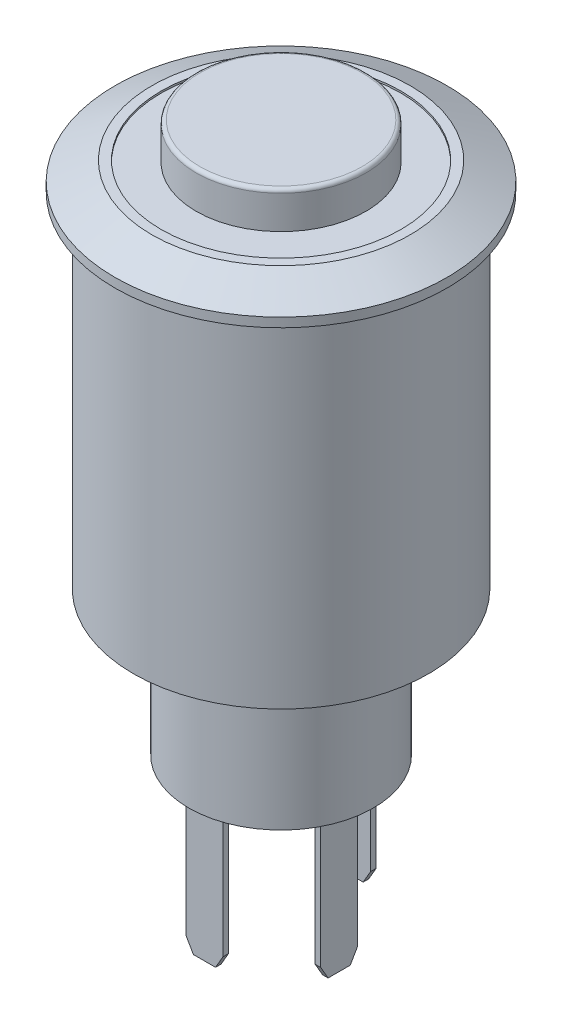
ISO-10303-21;
HEADER;
FILE_DESCRIPTION(('STEP AP214'),'2;1');
FILE_NAME('part.step','',(''),(''),'','','');
FILE_SCHEMA(('AUTOMOTIVE_DESIGN { 1 0 10303 214 1 1 1 1 }'));
ENDSEC;
DATA;
#1=APPLICATION_CONTEXT('core data for automotive mechanical design processes');
#2=APPLICATION_PROTOCOL_DEFINITION('international standard','automotive_design',2000,#1);
#3=PRODUCT_CONTEXT('',#1,'mechanical');
#4=PRODUCT('Part','Part','',(#3));
#5=PRODUCT_RELATED_PRODUCT_CATEGORY('part','',(#4));
#6=PRODUCT_DEFINITION_FORMATION('','',#4);
#7=PRODUCT_DEFINITION_CONTEXT('part definition',#1,'design');
#8=PRODUCT_DEFINITION('design','',#6,#7);
#9=PRODUCT_DEFINITION_SHAPE('','',#8);
#10=(LENGTH_UNIT() NAMED_UNIT(*) SI_UNIT(.MILLI.,.METRE.));
#11=(NAMED_UNIT(*) PLANE_ANGLE_UNIT() SI_UNIT($,.RADIAN.));
#12=(NAMED_UNIT(*) SI_UNIT($,.STERADIAN.) SOLID_ANGLE_UNIT());
#13=UNCERTAINTY_MEASURE_WITH_UNIT(LENGTH_MEASURE(1.E-05),#10,'distance_accuracy_value','');
#14=(GEOMETRIC_REPRESENTATION_CONTEXT(3) GLOBAL_UNCERTAINTY_ASSIGNED_CONTEXT((#13)) GLOBAL_UNIT_ASSIGNED_CONTEXT((#10,
#11,#12)) REPRESENTATION_CONTEXT('',''));
#15=CARTESIAN_POINT('',(0.,0.,0.));
#16=DIRECTION('',(0.,0.,1.));
#17=DIRECTION('',(1.,0.,0.));
#18=AXIS2_PLACEMENT_3D('',#15,#16,#17);
#19=CARTESIAN_POINT('',(0.,-26.4,5.));
#20=DIRECTION('',(0.,-1.,0.));
#21=DIRECTION('',(0.,0.,-1.));
#22=AXIS2_PLACEMENT_3D('',#19,#20,#21);
#23=PLANE('',#22);
#24=CARTESIAN_POINT('',(0.,-26.4,0.));
#25=DIRECTION('',(0.,1.,0.));
#26=DIRECTION('',(0.,0.,1.));
#27=AXIS2_PLACEMENT_3D('',#24,#25,#26);
#28=CIRCLE('',#27,5.);
#29=CARTESIAN_POINT('',(0.,-26.4,5.));
#30=VERTEX_POINT('',#29);
#31=EDGE_CURVE('E315',#30,#30,#28,.T.);
#32=ORIENTED_EDGE('',*,*,#31,.F.);
#33=EDGE_LOOP('',(#32));
#34=FACE_BOUND('',#33,.T.);
#35=DIRECTION('',(0.,0.,-1.));
#36=VECTOR('',#35,1.);
#37=CARTESIAN_POINT('',(0.999999999999999,-26.4,4.15));
#38=LINE('',#37,#36);
#39=CARTESIAN_POINT('',(0.999999999999999,-26.4,4.15));
#40=VERTEX_POINT('',#39);
#41=CARTESIAN_POINT('',(0.999999999999999,-26.4,3.85));
#42=VERTEX_POINT('',#41);
#43=EDGE_CURVE('E293',#40,#42,#38,.T.);
#44=ORIENTED_EDGE('',*,*,#43,.T.);
#45=DIRECTION('',(1.,0.,0.));
#46=VECTOR('',#45,1.);
#47=CARTESIAN_POINT('',(-1.,-26.4,3.85));
#48=LINE('',#47,#46);
#49=CARTESIAN_POINT('',(-1.,-26.4,3.85));
#50=VERTEX_POINT('',#49);
#51=EDGE_CURVE('E282',#50,#42,#48,.T.);
#52=ORIENTED_EDGE('',*,*,#51,.F.);
#53=DIRECTION('',(0.,0.,1.));
#54=VECTOR('',#53,1.);
#55=CARTESIAN_POINT('',(-1.,-26.4,3.85));
#56=LINE('',#55,#54);
#57=CARTESIAN_POINT('',(-1.,-26.4,4.15));
#58=VERTEX_POINT('',#57);
#59=EDGE_CURVE('E287',#50,#58,#56,.T.);
#60=ORIENTED_EDGE('',*,*,#59,.T.);
#61=DIRECTION('',(1.,0.,0.));
#62=VECTOR('',#61,1.);
#63=CARTESIAN_POINT('',(-1.,-26.4,4.15));
#64=LINE('',#63,#62);
#65=EDGE_CURVE('E296',#58,#40,#64,.T.);
#66=ORIENTED_EDGE('',*,*,#65,.T.);
#67=EDGE_LOOP('',(#44,#52,#60,#66));
#68=FACE_BOUND('',#67,.T.);
#69=DIRECTION('',(0.,0.,-1.));
#70=VECTOR('',#69,1.);
#71=CARTESIAN_POINT('',(0.999999999999999,-26.4,-3.85));
#72=LINE('',#71,#70);
#73=CARTESIAN_POINT('',(0.999999999999999,-26.4,-3.85));
#74=VERTEX_POINT('',#73);
#75=CARTESIAN_POINT('',(0.999999999999999,-26.4,-4.15));
#76=VERTEX_POINT('',#75);
#77=EDGE_CURVE('E267',#74,#76,#72,.T.);
#78=ORIENTED_EDGE('',*,*,#77,.T.);
#79=DIRECTION('',(1.,0.,0.));
#80=VECTOR('',#79,1.);
#81=CARTESIAN_POINT('',(-1.,-26.4,-4.15));
#82=LINE('',#81,#80);
#83=CARTESIAN_POINT('',(-1.,-26.4,-4.15));
#84=VERTEX_POINT('',#83);
#85=EDGE_CURVE('E256',#84,#76,#82,.T.);
#86=ORIENTED_EDGE('',*,*,#85,.F.);
#87=DIRECTION('',(0.,0.,1.));
#88=VECTOR('',#87,1.);
#89=CARTESIAN_POINT('',(-1.,-26.4,-4.15));
#90=LINE('',#89,#88);
#91=CARTESIAN_POINT('',(-1.,-26.4,-3.85));
#92=VERTEX_POINT('',#91);
#93=EDGE_CURVE('E261',#84,#92,#90,.T.);
#94=ORIENTED_EDGE('',*,*,#93,.T.);
#95=DIRECTION('',(1.,0.,0.));
#96=VECTOR('',#95,1.);
#97=CARTESIAN_POINT('',(-1.,-26.4,-3.85));
#98=LINE('',#97,#96);
#99=EDGE_CURVE('E270',#92,#74,#98,.T.);
#100=ORIENTED_EDGE('',*,*,#99,.T.);
#101=EDGE_LOOP('',(#78,#86,#94,#100));
#102=FACE_BOUND('',#101,.T.);
#103=DIRECTION('',(-1.,0.,0.));
#104=VECTOR('',#103,1.);
#105=CARTESIAN_POINT('',(-3.85,-26.4,-1.));
#106=LINE('',#105,#104);
#107=CARTESIAN_POINT('',(-3.85,-26.4,-1.));
#108=VERTEX_POINT('',#107);
#109=CARTESIAN_POINT('',(-4.15,-26.4,-1.));
#110=VERTEX_POINT('',#109);
#111=EDGE_CURVE('E241',#108,#110,#106,.T.);
#112=ORIENTED_EDGE('',*,*,#111,.T.);
#113=DIRECTION('',(0.,0.,1.));
#114=VECTOR('',#113,1.);
#115=CARTESIAN_POINT('',(-4.15,-26.4,1.));
#116=LINE('',#115,#114);
#117=CARTESIAN_POINT('',(-4.15,-26.4,1.));
#118=VERTEX_POINT('',#117);
#119=EDGE_CURVE('E230',#118,#110,#116,.F.);
#120=ORIENTED_EDGE('',*,*,#119,.F.);
#121=DIRECTION('',(1.,0.,0.));
#122=VECTOR('',#121,1.);
#123=CARTESIAN_POINT('',(-4.15,-26.4,1.));
#124=LINE('',#123,#122);
#125=CARTESIAN_POINT('',(-3.85,-26.4,1.));
#126=VERTEX_POINT('',#125);
#127=EDGE_CURVE('E235',#118,#126,#124,.T.);
#128=ORIENTED_EDGE('',*,*,#127,.T.);
#129=DIRECTION('',(0.,0.,1.));
#130=VECTOR('',#129,1.);
#131=CARTESIAN_POINT('',(-3.85,-26.4,1.));
#132=LINE('',#131,#130);
#133=EDGE_CURVE('E244',#126,#108,#132,.F.);
#134=ORIENTED_EDGE('',*,*,#133,.T.);
#135=EDGE_LOOP('',(#112,#120,#128,#134));
#136=FACE_BOUND('',#135,.T.);
#137=DIRECTION('',(1.,0.,0.));
#138=VECTOR('',#137,1.);
#139=CARTESIAN_POINT('',(3.85,-26.4,2.));
#140=LINE('',#139,#138);
#141=CARTESIAN_POINT('',(3.85,-26.4,2.));
#142=VERTEX_POINT('',#141);
#143=CARTESIAN_POINT('',(4.15,-26.4,2.));
#144=VERTEX_POINT('',#143);
#145=EDGE_CURVE('E214',#142,#144,#140,.T.);
#146=ORIENTED_EDGE('',*,*,#145,.T.);
#147=DIRECTION('',(0.,0.,1.));
#148=VECTOR('',#147,1.);
#149=CARTESIAN_POINT('',(4.15,-26.4,0.));
#150=LINE('',#149,#148);
#151=CARTESIAN_POINT('',(4.15,-26.4,0.));
#152=VERTEX_POINT('',#151);
#153=EDGE_CURVE('E198',#152,#144,#150,.T.);
#154=ORIENTED_EDGE('',*,*,#153,.F.);
#155=DIRECTION('',(-1.,0.,0.));
#156=VECTOR('',#155,1.);
#157=CARTESIAN_POINT('',(4.15,-26.4,0.));
#158=LINE('',#157,#156);
#159=CARTESIAN_POINT('',(3.85,-26.4,0.));
#160=VERTEX_POINT('',#159);
#161=EDGE_CURVE('E211',#152,#160,#158,.T.);
#162=ORIENTED_EDGE('',*,*,#161,.T.);
#163=DIRECTION('',(0.,0.,1.));
#164=VECTOR('',#163,1.);
#165=CARTESIAN_POINT('',(3.85,-26.4,0.));
#166=LINE('',#165,#164);
#167=EDGE_CURVE('E219',#160,#142,#166,.T.);
#168=ORIENTED_EDGE('',*,*,#167,.T.);
#169=EDGE_LOOP('',(#146,#154,#162,#168));
#170=FACE_BOUND('',#169,.T.);
#171=ADVANCED_FACE('F35',(#34,#68,#102,#136,#170),#23,.T.);
#172=CARTESIAN_POINT('',(0.,1.5,4.6));
#173=DIRECTION('',(0.,1.,0.));
#174=DIRECTION('',(0.,0.,1.));
#175=AXIS2_PLACEMENT_3D('',#172,#173,#174);
#176=PLANE('',#175);
#177=CARTESIAN_POINT('',(0.,1.5,0.));
#178=DIRECTION('',(0.,1.,0.));
#179=DIRECTION('',(0.,0.,1.));
#180=AXIS2_PLACEMENT_3D('',#177,#178,#179);
#181=CIRCLE('',#180,6.5);
#182=CARTESIAN_POINT('',(0.,1.5,6.5));
#183=VERTEX_POINT('',#182);
#184=EDGE_CURVE('E311',#183,#183,#181,.T.);
#185=ORIENTED_EDGE('',*,*,#184,.F.);
#186=EDGE_LOOP('',(#185));
#187=FACE_BOUND('',#186,.T.);
#188=CARTESIAN_POINT('',(0.,1.5,0.));
#189=DIRECTION('',(0.,1.,0.));
#190=DIRECTION('',(0.,0.,1.));
#191=AXIS2_PLACEMENT_3D('',#188,#189,#190);
#192=CIRCLE('',#191,7.);
#193=CARTESIAN_POINT('',(0.,1.5,7.));
#194=VERTEX_POINT('',#193);
#195=EDGE_CURVE('E335',#194,#194,#192,.T.);
#196=ORIENTED_EDGE('',*,*,#195,.T.);
#197=EDGE_LOOP('',(#196));
#198=FACE_BOUND('',#197,.T.);
#199=ADVANCED_FACE('F428',(#187,#198),#176,.T.);
#200=CARTESIAN_POINT('',(0.,1.5,0.));
#201=DIRECTION('',(0.,-1.,0.));
#202=DIRECTION('',(0.,0.,-1.));
#203=AXIS2_PLACEMENT_3D('',#200,#201,#202);
#204=CONICAL_SURFACE('',#203,7.,1.10714871779409);
#205=CARTESIAN_POINT('',(0.,0.5,0.));
#206=DIRECTION('',(0.,1.,0.));
#207=DIRECTION('',(0.,0.,1.));
#208=AXIS2_PLACEMENT_3D('',#205,#206,#207);
#209=CIRCLE('',#208,9.);
#210=CARTESIAN_POINT('',(0.,0.5,9.));
#211=VERTEX_POINT('',#210);
#212=EDGE_CURVE('E332',#211,#211,#209,.T.);
#213=ORIENTED_EDGE('',*,*,#212,.T.);
#214=EDGE_LOOP('',(#213));
#215=FACE_BOUND('',#214,.T.);
#216=ORIENTED_EDGE('',*,*,#195,.F.);
#217=EDGE_LOOP('',(#216));
#218=FACE_BOUND('',#217,.T.);
#219=ADVANCED_FACE('F434',(#215,#218),#204,.T.);
#220=CARTESIAN_POINT('',(0.,14.375,0.));
#221=DIRECTION('',(0.,1.,0.));
#222=DIRECTION('',(0.,0.,1.));
#223=AXIS2_PLACEMENT_3D('',#220,#221,#222);
#224=CYLINDRICAL_SURFACE('',#223,9.);
#225=CARTESIAN_POINT('',(0.,0.,0.));
#226=DIRECTION('',(0.,1.,0.));
#227=DIRECTION('',(0.,0.,1.));
#228=AXIS2_PLACEMENT_3D('',#225,#226,#227);
#229=CIRCLE('',#228,9.);
#230=CARTESIAN_POINT('',(0.,0.,9.));
#231=VERTEX_POINT('',#230);
#232=EDGE_CURVE('E329',#231,#231,#229,.T.);
#233=ORIENTED_EDGE('',*,*,#232,.T.);
#234=EDGE_LOOP('',(#233));
#235=FACE_BOUND('',#234,.T.);
#236=ORIENTED_EDGE('',*,*,#212,.F.);
#237=EDGE_LOOP('',(#236));
#238=FACE_BOUND('',#237,.T.);
#239=ADVANCED_FACE('F458',(#235,#238),#224,.T.);
#240=CARTESIAN_POINT('',(0.,0.,9.));
#241=DIRECTION('',(0.,-1.,0.));
#242=DIRECTION('',(0.,0.,-1.));
#243=AXIS2_PLACEMENT_3D('',#240,#241,#242);
#244=PLANE('',#243);
#245=CARTESIAN_POINT('',(0.,0.,0.));
#246=DIRECTION('',(0.,1.,0.));
#247=DIRECTION('',(0.,0.,1.));
#248=AXIS2_PLACEMENT_3D('',#245,#246,#247);
#249=CIRCLE('',#248,8.);
#250=CARTESIAN_POINT('',(0.,0.,8.));
#251=VERTEX_POINT('',#250);
#252=EDGE_CURVE('E326',#251,#251,#249,.T.);
#253=ORIENTED_EDGE('',*,*,#252,.T.);
#254=EDGE_LOOP('',(#253));
#255=FACE_BOUND('',#254,.T.);
#256=ORIENTED_EDGE('',*,*,#232,.F.);
#257=EDGE_LOOP('',(#256));
#258=FACE_BOUND('',#257,.T.);
#259=ADVANCED_FACE('F454',(#255,#258),#244,.T.);
#260=CARTESIAN_POINT('',(0.,14.375,0.));
#261=DIRECTION('',(0.,1.,0.));
#262=DIRECTION('',(0.,0.,1.));
#263=AXIS2_PLACEMENT_3D('',#260,#261,#262);
#264=CYLINDRICAL_SURFACE('',#263,8.);
#265=CARTESIAN_POINT('',(0.,-18.6,0.));
#266=DIRECTION('',(0.,1.,0.));
#267=DIRECTION('',(0.,0.,1.));
#268=AXIS2_PLACEMENT_3D('',#265,#266,#267);
#269=CIRCLE('',#268,8.);
#270=CARTESIAN_POINT('',(0.,-18.6,8.));
#271=VERTEX_POINT('',#270);
#272=EDGE_CURVE('E323',#271,#271,#269,.T.);
#273=ORIENTED_EDGE('',*,*,#272,.T.);
#274=EDGE_LOOP('',(#273));
#275=FACE_BOUND('',#274,.T.);
#276=ORIENTED_EDGE('',*,*,#252,.F.);
#277=EDGE_LOOP('',(#276));
#278=FACE_BOUND('',#277,.T.);
#279=ADVANCED_FACE('F450',(#275,#278),#264,.T.);
#280=CARTESIAN_POINT('',(0.,-18.6,8.));
#281=DIRECTION('',(0.,-1.,0.));
#282=DIRECTION('',(0.,0.,-1.));
#283=AXIS2_PLACEMENT_3D('',#280,#281,#282);
#284=PLANE('',#283);
#285=CARTESIAN_POINT('',(0.,-18.6,0.));
#286=DIRECTION('',(0.,1.,0.));
#287=DIRECTION('',(0.,0.,1.));
#288=AXIS2_PLACEMENT_3D('',#285,#286,#287);
#289=CIRCLE('',#288,5.);
#290=CARTESIAN_POINT('',(0.,-18.6,5.));
#291=VERTEX_POINT('',#290);
#292=EDGE_CURVE('E320',#291,#291,#289,.T.);
#293=ORIENTED_EDGE('',*,*,#292,.T.);
#294=EDGE_LOOP('',(#293));
#295=FACE_BOUND('',#294,.T.);
#296=ORIENTED_EDGE('',*,*,#272,.F.);
#297=EDGE_LOOP('',(#296));
#298=FACE_BOUND('',#297,.T.);
#299=ADVANCED_FACE('F446',(#295,#298),#284,.T.);
#300=CARTESIAN_POINT('',(0.,14.375,0.));
#301=DIRECTION('',(0.,1.,0.));
#302=DIRECTION('',(0.,0.,1.));
#303=AXIS2_PLACEMENT_3D('',#300,#301,#302);
#304=CYLINDRICAL_SURFACE('',#303,5.);
#305=ORIENTED_EDGE('',*,*,#31,.T.);
#306=EDGE_LOOP('',(#305));
#307=FACE_BOUND('',#306,.T.);
#308=ORIENTED_EDGE('',*,*,#292,.F.);
#309=EDGE_LOOP('',(#308));
#310=FACE_BOUND('',#309,.T.);
#311=ADVANCED_FACE('F443',(#307,#310),#304,.T.);
#312=CARTESIAN_POINT('',(0.,1.4,0.));
#313=DIRECTION('',(0.,1.,0.));
#314=DIRECTION('',(0.,0.,1.));
#315=AXIS2_PLACEMENT_3D('',#312,#313,#314);
#316=CYLINDRICAL_SURFACE('',#315,6.5);
#317=CARTESIAN_POINT('',(0.,1.4,0.));
#318=DIRECTION('',(0.,1.,0.));
#319=DIRECTION('',(0.,0.,1.));
#320=AXIS2_PLACEMENT_3D('',#317,#318,#319);
#321=CIRCLE('',#320,6.5);
#322=CARTESIAN_POINT('',(0.,1.4,6.5));
#323=VERTEX_POINT('',#322);
#324=EDGE_CURVE('E312',#323,#323,#321,.T.);
#325=ORIENTED_EDGE('',*,*,#324,.F.);
#326=EDGE_LOOP('',(#325));
#327=FACE_BOUND('',#326,.T.);
#328=ORIENTED_EDGE('',*,*,#184,.T.);
#329=EDGE_LOOP('',(#328));
#330=FACE_BOUND('',#329,.T.);
#331=ADVANCED_FACE('F441',(#327,#330),#316,.F.);
#332=CARTESIAN_POINT('',(0.,1.4,0.));
#333=DIRECTION('',(0.,1.,0.));
#334=DIRECTION('',(0.,0.,1.));
#335=AXIS2_PLACEMENT_3D('',#332,#333,#334);
#336=PLANE('',#335);
#337=CARTESIAN_POINT('',(0.,1.4,0.));
#338=DIRECTION('',(0.,1.,0.));
#339=DIRECTION('',(0.,0.,1.));
#340=AXIS2_PLACEMENT_3D('',#337,#338,#339);
#341=CIRCLE('',#340,4.6);
#342=CARTESIAN_POINT('',(0.,1.4,4.6));
#343=VERTEX_POINT('',#342);
#344=EDGE_CURVE('E308',#343,#343,#341,.T.);
#345=ORIENTED_EDGE('',*,*,#344,.F.);
#346=EDGE_LOOP('',(#345));
#347=FACE_BOUND('',#346,.T.);
#348=ORIENTED_EDGE('',*,*,#324,.T.);
#349=EDGE_LOOP('',(#348));
#350=FACE_BOUND('',#349,.T.);
#351=ADVANCED_FACE('F475',(#347,#350),#336,.T.);
#352=CARTESIAN_POINT('',(0.,3.4,0.));
#353=DIRECTION('',(0.,1.,0.));
#354=DIRECTION('',(0.,0.,1.));
#355=AXIS2_PLACEMENT_3D('',#352,#353,#354);
#356=PLANE('',#355);
#357=CARTESIAN_POINT('',(0.,3.4,0.));
#358=DIRECTION('',(0.,1.,0.));
#359=DIRECTION('',(0.,0.,1.));
#360=AXIS2_PLACEMENT_3D('',#357,#358,#359);
#361=CIRCLE('',#360,4.4);
#362=CARTESIAN_POINT('',(0.,3.4,4.4));
#363=VERTEX_POINT('',#362);
#364=EDGE_CURVE('E338',#363,#363,#361,.T.);
#365=ORIENTED_EDGE('',*,*,#364,.T.);
#366=EDGE_LOOP('',(#365));
#367=FACE_BOUND('',#366,.T.);
#368=ADVANCED_FACE('F472',(#367),#356,.T.);
#369=CARTESIAN_POINT('',(0.,3.2,0.));
#370=DIRECTION('',(0.,1.,0.));
#371=DIRECTION('',(0.,0.,1.));
#372=AXIS2_PLACEMENT_3D('',#369,#370,#371);
#373=TOROIDAL_SURFACE('',#372,4.4,0.2);
#374=CARTESIAN_POINT('',(0.,3.2,0.));
#375=DIRECTION('',(0.,1.,0.));
#376=DIRECTION('',(0.,0.,1.));
#377=AXIS2_PLACEMENT_3D('',#374,#375,#376);
#378=CIRCLE('',#377,4.6);
#379=CARTESIAN_POINT('',(0.,3.2,4.6));
#380=VERTEX_POINT('',#379);
#381=EDGE_CURVE('E341',#380,#380,#378,.F.);
#382=ORIENTED_EDGE('',*,*,#381,.F.);
#383=EDGE_LOOP('',(#382));
#384=FACE_BOUND('',#383,.T.);
#385=ORIENTED_EDGE('',*,*,#364,.F.);
#386=EDGE_LOOP('',(#385));
#387=FACE_BOUND('',#386,.T.);
#388=ADVANCED_FACE('F470',(#384,#387),#373,.T.);
#389=CARTESIAN_POINT('',(0.,14.375,0.));
#390=DIRECTION('',(0.,1.,0.));
#391=DIRECTION('',(0.,0.,1.));
#392=AXIS2_PLACEMENT_3D('',#389,#390,#391);
#393=CYLINDRICAL_SURFACE('',#392,4.6);
#394=ORIENTED_EDGE('',*,*,#381,.T.);
#395=EDGE_LOOP('',(#394));
#396=FACE_BOUND('',#395,.T.);
#397=ORIENTED_EDGE('',*,*,#344,.T.);
#398=EDGE_LOOP('',(#397));
#399=FACE_BOUND('',#398,.T.);
#400=ADVANCED_FACE('F466',(#396,#399),#393,.T.);
#401=CARTESIAN_POINT('',(-1.,-34.,3.85));
#402=DIRECTION('',(0.,0.,1.));
#403=DIRECTION('',(1.,0.,0.));
#404=AXIS2_PLACEMENT_3D('',#401,#402,#403);
#405=PLANE('',#404);
#406=DIRECTION('',(1.,0.,0.));
#407=VECTOR('',#406,1.);
#408=CARTESIAN_POINT('',(-1.,-34.,3.85));
#409=LINE('',#408,#407);
#410=CARTESIAN_POINT('',(-0.6,-34.,3.85));
#411=VERTEX_POINT('',#410);
#412=CARTESIAN_POINT('',(0.599999999999998,-34.,3.85));
#413=VERTEX_POINT('',#412);
#414=EDGE_CURVE('E283',#411,#413,#409,.T.);
#415=ORIENTED_EDGE('',*,*,#414,.F.);
#416=DIRECTION('',(-0.499999999999996,0.866025403784441,0.));
#417=VECTOR('',#416,1.);
#418=CARTESIAN_POINT('',(-1.,-33.3071796769724,3.85));
#419=LINE('',#418,#417);
#420=CARTESIAN_POINT('',(-1.,-33.3071796769724,3.85));
#421=VERTEX_POINT('',#420);
#422=EDGE_CURVE('E357',#411,#421,#419,.T.);
#423=ORIENTED_EDGE('',*,*,#422,.T.);
#424=DIRECTION('',(0.,1.,0.));
#425=VECTOR('',#424,1.);
#426=CARTESIAN_POINT('',(-1.,-34.,3.85));
#427=LINE('',#426,#425);
#428=EDGE_CURVE('E290',#421,#50,#427,.T.);
#429=ORIENTED_EDGE('',*,*,#428,.T.);
#430=ORIENTED_EDGE('',*,*,#51,.T.);
#431=DIRECTION('',(0.,1.,0.));
#432=VECTOR('',#431,1.);
#433=CARTESIAN_POINT('',(0.999999999999999,-34.,3.85));
#434=LINE('',#433,#432);
#435=CARTESIAN_POINT('',(0.999999999999999,-33.3071796769724,3.85));
#436=VERTEX_POINT('',#435);
#437=EDGE_CURVE('E306',#436,#42,#434,.T.);
#438=ORIENTED_EDGE('',*,*,#437,.F.);
#439=DIRECTION('',(-0.499999999999996,-0.866025403784441,0.));
#440=VECTOR('',#439,1.);
#441=CARTESIAN_POINT('',(0.999999999999999,-33.3071796769724,3.85));
#442=LINE('',#441,#440);
#443=EDGE_CURVE('E355',#436,#413,#442,.T.);
#444=ORIENTED_EDGE('',*,*,#443,.T.);
#445=EDGE_LOOP('',(#415,#423,#429,#430,#438,#444));
#446=FACE_BOUND('',#445,.T.);
#447=ADVANCED_FACE('F469',(#446),#405,.F.);
#448=CARTESIAN_POINT('',(0.999999999999999,-34.,4.15));
#449=DIRECTION('',(1.,0.,0.));
#450=DIRECTION('',(0.,0.,-1.));
#451=AXIS2_PLACEMENT_3D('',#448,#449,#450);
#452=PLANE('',#451);
#453=DIRECTION('',(0.,1.,0.));
#454=VECTOR('',#453,1.);
#455=CARTESIAN_POINT('',(0.999999999999999,-34.,4.15));
#456=LINE('',#455,#454);
#457=CARTESIAN_POINT('',(0.999999999999999,-33.3071796769724,4.15));
#458=VERTEX_POINT('',#457);
#459=EDGE_CURVE('E304',#458,#40,#456,.T.);
#460=ORIENTED_EDGE('',*,*,#459,.F.);
#461=DIRECTION('',(0.,0.,-1.));
#462=VECTOR('',#461,1.);
#463=CARTESIAN_POINT('',(0.999999999999999,-33.3071796769724,3.85));
#464=LINE('',#463,#462);
#465=EDGE_CURVE('E359',#458,#436,#464,.T.);
#466=ORIENTED_EDGE('',*,*,#465,.T.);
#467=ORIENTED_EDGE('',*,*,#437,.T.);
#468=ORIENTED_EDGE('',*,*,#43,.F.);
#469=EDGE_LOOP('',(#460,#466,#467,#468));
#470=FACE_BOUND('',#469,.T.);
#471=ADVANCED_FACE('F562',(#470),#452,.T.);
#472=CARTESIAN_POINT('',(-1.,-34.,4.15));
#473=DIRECTION('',(0.,0.,1.));
#474=DIRECTION('',(1.,0.,0.));
#475=AXIS2_PLACEMENT_3D('',#472,#473,#474);
#476=PLANE('',#475);
#477=DIRECTION('',(0.,1.,0.));
#478=VECTOR('',#477,1.);
#479=CARTESIAN_POINT('',(-1.,-34.,4.15));
#480=LINE('',#479,#478);
#481=CARTESIAN_POINT('',(-1.,-33.3071796769724,4.15));
#482=VERTEX_POINT('',#481);
#483=EDGE_CURVE('E302',#482,#58,#480,.T.);
#484=ORIENTED_EDGE('',*,*,#483,.F.);
#485=DIRECTION('',(0.499999999999996,-0.866025403784441,0.));
#486=VECTOR('',#485,1.);
#487=CARTESIAN_POINT('',(-0.699999999999998,-33.8267949192431,4.15));
#488=LINE('',#487,#486);
#489=CARTESIAN_POINT('',(-0.6,-34.,4.15));
#490=VERTEX_POINT('',#489);
#491=EDGE_CURVE('E349',#482,#490,#488,.T.);
#492=ORIENTED_EDGE('',*,*,#491,.T.);
#493=DIRECTION('',(1.,0.,0.));
#494=VECTOR('',#493,1.);
#495=CARTESIAN_POINT('',(-1.,-34.,4.15));
#496=LINE('',#495,#494);
#497=CARTESIAN_POINT('',(0.599999999999998,-34.,4.15));
#498=VERTEX_POINT('',#497);
#499=EDGE_CURVE('E286',#490,#498,#496,.T.);
#500=ORIENTED_EDGE('',*,*,#499,.T.);
#501=DIRECTION('',(0.499999999999996,0.866025403784441,0.));
#502=VECTOR('',#501,1.);
#503=CARTESIAN_POINT('',(0.200000000000005,-34.6928203230275,4.15));
#504=LINE('',#503,#502);
#505=EDGE_CURVE('E347',#498,#458,#504,.T.);
#506=ORIENTED_EDGE('',*,*,#505,.T.);
#507=ORIENTED_EDGE('',*,*,#459,.T.);
#508=ORIENTED_EDGE('',*,*,#65,.F.);
#509=EDGE_LOOP('',(#484,#492,#500,#506,#507,#508));
#510=FACE_BOUND('',#509,.T.);
#511=ADVANCED_FACE('F558',(#510),#476,.T.);
#512=CARTESIAN_POINT('',(-1.,-34.,3.85));
#513=DIRECTION('',(-1.,0.,0.));
#514=DIRECTION('',(0.,0.,1.));
#515=AXIS2_PLACEMENT_3D('',#512,#513,#514);
#516=PLANE('',#515);
#517=ORIENTED_EDGE('',*,*,#428,.F.);
#518=DIRECTION('',(0.,0.,1.));
#519=VECTOR('',#518,1.);
#520=CARTESIAN_POINT('',(-1.,-33.3071796769724,4.15));
#521=LINE('',#520,#519);
#522=EDGE_CURVE('E344',#421,#482,#521,.T.);
#523=ORIENTED_EDGE('',*,*,#522,.T.);
#524=ORIENTED_EDGE('',*,*,#483,.T.);
#525=ORIENTED_EDGE('',*,*,#59,.F.);
#526=EDGE_LOOP('',(#517,#523,#524,#525));
#527=FACE_BOUND('',#526,.T.);
#528=ADVANCED_FACE('F554',(#527),#516,.T.);
#529=CARTESIAN_POINT('',(0.,-34.,0.));
#530=DIRECTION('',(0.,1.,0.));
#531=DIRECTION('',(-1.,0.,0.));
#532=AXIS2_PLACEMENT_3D('',#529,#530,#531);
#533=PLANE('',#532);
#534=ORIENTED_EDGE('',*,*,#499,.F.);
#535=DIRECTION('',(0.,0.,-1.));
#536=VECTOR('',#535,1.);
#537=CARTESIAN_POINT('',(-0.6,-34.,3.85));
#538=LINE('',#537,#536);
#539=EDGE_CURVE('E353',#490,#411,#538,.T.);
#540=ORIENTED_EDGE('',*,*,#539,.T.);
#541=ORIENTED_EDGE('',*,*,#414,.T.);
#542=DIRECTION('',(0.,0.,1.));
#543=VECTOR('',#542,1.);
#544=CARTESIAN_POINT('',(0.599999999999998,-34.,4.15));
#545=LINE('',#544,#543);
#546=EDGE_CURVE('E351',#413,#498,#545,.T.);
#547=ORIENTED_EDGE('',*,*,#546,.T.);
#548=EDGE_LOOP('',(#534,#540,#541,#547));
#549=FACE_BOUND('',#548,.T.);
#550=ADVANCED_FACE('F551',(#549),#533,.F.);
#551=CARTESIAN_POINT('',(-1.,-34.,-4.15));
#552=DIRECTION('',(0.,0.,1.));
#553=DIRECTION('',(1.,0.,0.));
#554=AXIS2_PLACEMENT_3D('',#551,#552,#553);
#555=PLANE('',#554);
#556=DIRECTION('',(1.,0.,0.));
#557=VECTOR('',#556,1.);
#558=CARTESIAN_POINT('',(-1.,-34.,-4.15));
#559=LINE('',#558,#557);
#560=CARTESIAN_POINT('',(-0.6,-34.,-4.15));
#561=VERTEX_POINT('',#560);
#562=CARTESIAN_POINT('',(0.599999999999998,-34.,-4.15));
#563=VERTEX_POINT('',#562);
#564=EDGE_CURVE('E257',#561,#563,#559,.T.);
#565=ORIENTED_EDGE('',*,*,#564,.F.);
#566=DIRECTION('',(-0.499999999999996,0.866025403784441,0.));
#567=VECTOR('',#566,1.);
#568=CARTESIAN_POINT('',(-1.,-33.3071796769724,-4.15));
#569=LINE('',#568,#567);
#570=CARTESIAN_POINT('',(-1.,-33.3071796769724,-4.15));
#571=VERTEX_POINT('',#570);
#572=EDGE_CURVE('E393',#561,#571,#569,.T.);
#573=ORIENTED_EDGE('',*,*,#572,.T.);
#574=DIRECTION('',(0.,1.,0.));
#575=VECTOR('',#574,1.);
#576=CARTESIAN_POINT('',(-1.,-34.,-4.15));
#577=LINE('',#576,#575);
#578=EDGE_CURVE('E264',#571,#84,#577,.T.);
#579=ORIENTED_EDGE('',*,*,#578,.T.);
#580=ORIENTED_EDGE('',*,*,#85,.T.);
#581=DIRECTION('',(0.,1.,0.));
#582=VECTOR('',#581,1.);
#583=CARTESIAN_POINT('',(0.999999999999999,-34.,-4.15));
#584=LINE('',#583,#582);
#585=CARTESIAN_POINT('',(0.999999999999999,-33.3071796769724,-4.15));
#586=VERTEX_POINT('',#585);
#587=EDGE_CURVE('E280',#586,#76,#584,.T.);
#588=ORIENTED_EDGE('',*,*,#587,.F.);
#589=DIRECTION('',(-0.499999999999996,-0.866025403784441,0.));
#590=VECTOR('',#589,1.);
#591=CARTESIAN_POINT('',(0.999999999999999,-33.3071796769724,-4.15));
#592=LINE('',#591,#590);
#593=EDGE_CURVE('E391',#586,#563,#592,.T.);
#594=ORIENTED_EDGE('',*,*,#593,.T.);
#595=EDGE_LOOP('',(#565,#573,#579,#580,#588,#594));
#596=FACE_BOUND('',#595,.T.);
#597=ADVANCED_FACE('F523',(#596),#555,.F.);
#598=CARTESIAN_POINT('',(0.999999999999999,-34.,-3.85));
#599=DIRECTION('',(1.,0.,0.));
#600=DIRECTION('',(0.,0.,-1.));
#601=AXIS2_PLACEMENT_3D('',#598,#599,#600);
#602=PLANE('',#601);
#603=DIRECTION('',(0.,1.,0.));
#604=VECTOR('',#603,1.);
#605=CARTESIAN_POINT('',(0.999999999999999,-34.,-3.85));
#606=LINE('',#605,#604);
#607=CARTESIAN_POINT('',(0.999999999999999,-33.3071796769724,-3.85));
#608=VERTEX_POINT('',#607);
#609=EDGE_CURVE('E278',#608,#74,#606,.T.);
#610=ORIENTED_EDGE('',*,*,#609,.F.);
#611=DIRECTION('',(0.,0.,-1.));
#612=VECTOR('',#611,1.);
#613=CARTESIAN_POINT('',(0.999999999999999,-33.3071796769724,-4.15));
#614=LINE('',#613,#612);
#615=EDGE_CURVE('E395',#608,#586,#614,.T.);
#616=ORIENTED_EDGE('',*,*,#615,.T.);
#617=ORIENTED_EDGE('',*,*,#587,.T.);
#618=ORIENTED_EDGE('',*,*,#77,.F.);
#619=EDGE_LOOP('',(#610,#616,#617,#618));
#620=FACE_BOUND('',#619,.T.);
#621=ADVANCED_FACE('F515',(#620),#602,.T.);
#622=CARTESIAN_POINT('',(-1.,-34.,-3.85));
#623=DIRECTION('',(0.,0.,1.));
#624=DIRECTION('',(1.,0.,0.));
#625=AXIS2_PLACEMENT_3D('',#622,#623,#624);
#626=PLANE('',#625);
#627=DIRECTION('',(0.,1.,0.));
#628=VECTOR('',#627,1.);
#629=CARTESIAN_POINT('',(-1.,-34.,-3.85));
#630=LINE('',#629,#628);
#631=CARTESIAN_POINT('',(-1.,-33.3071796769724,-3.85));
#632=VERTEX_POINT('',#631);
#633=EDGE_CURVE('E276',#632,#92,#630,.T.);
#634=ORIENTED_EDGE('',*,*,#633,.F.);
#635=DIRECTION('',(0.499999999999996,-0.866025403784441,0.));
#636=VECTOR('',#635,1.);
#637=CARTESIAN_POINT('',(-0.699999999999998,-33.8267949192431,-3.85));
#638=LINE('',#637,#636);
#639=CARTESIAN_POINT('',(-0.6,-34.,-3.85));
#640=VERTEX_POINT('',#639);
#641=EDGE_CURVE('E385',#632,#640,#638,.T.);
#642=ORIENTED_EDGE('',*,*,#641,.T.);
#643=DIRECTION('',(1.,0.,0.));
#644=VECTOR('',#643,1.);
#645=CARTESIAN_POINT('',(-1.,-34.,-3.85));
#646=LINE('',#645,#644);
#647=CARTESIAN_POINT('',(0.599999999999998,-34.,-3.85));
#648=VERTEX_POINT('',#647);
#649=EDGE_CURVE('E260',#640,#648,#646,.T.);
#650=ORIENTED_EDGE('',*,*,#649,.T.);
#651=DIRECTION('',(0.499999999999996,0.866025403784441,0.));
#652=VECTOR('',#651,1.);
#653=CARTESIAN_POINT('',(0.200000000000005,-34.6928203230275,-3.85));
#654=LINE('',#653,#652);
#655=EDGE_CURVE('E383',#648,#608,#654,.T.);
#656=ORIENTED_EDGE('',*,*,#655,.T.);
#657=ORIENTED_EDGE('',*,*,#609,.T.);
#658=ORIENTED_EDGE('',*,*,#99,.F.);
#659=EDGE_LOOP('',(#634,#642,#650,#656,#657,#658));
#660=FACE_BOUND('',#659,.T.);
#661=ADVANCED_FACE('F510',(#660),#626,.T.);
#662=CARTESIAN_POINT('',(-1.,-34.,-4.15));
#663=DIRECTION('',(-1.,0.,0.));
#664=DIRECTION('',(0.,0.,1.));
#665=AXIS2_PLACEMENT_3D('',#662,#663,#664);
#666=PLANE('',#665);
#667=ORIENTED_EDGE('',*,*,#578,.F.);
#668=DIRECTION('',(0.,0.,1.));
#669=VECTOR('',#668,1.);
#670=CARTESIAN_POINT('',(-1.,-33.3071796769724,-3.85));
#671=LINE('',#670,#669);
#672=EDGE_CURVE('E380',#571,#632,#671,.T.);
#673=ORIENTED_EDGE('',*,*,#672,.T.);
#674=ORIENTED_EDGE('',*,*,#633,.T.);
#675=ORIENTED_EDGE('',*,*,#93,.F.);
#676=EDGE_LOOP('',(#667,#673,#674,#675));
#677=FACE_BOUND('',#676,.T.);
#678=ADVANCED_FACE('F528',(#677),#666,.T.);
#679=CARTESIAN_POINT('',(0.,-34.,0.));
#680=DIRECTION('',(0.,1.,0.));
#681=DIRECTION('',(-1.,0.,0.));
#682=AXIS2_PLACEMENT_3D('',#679,#680,#681);
#683=PLANE('',#682);
#684=ORIENTED_EDGE('',*,*,#649,.F.);
#685=DIRECTION('',(0.,0.,-1.));
#686=VECTOR('',#685,1.);
#687=CARTESIAN_POINT('',(-0.6,-34.,-4.15));
#688=LINE('',#687,#686);
#689=EDGE_CURVE('E389',#640,#561,#688,.T.);
#690=ORIENTED_EDGE('',*,*,#689,.T.);
#691=ORIENTED_EDGE('',*,*,#564,.T.);
#692=DIRECTION('',(0.,0.,1.));
#693=VECTOR('',#692,1.);
#694=CARTESIAN_POINT('',(0.599999999999998,-34.,-3.85));
#695=LINE('',#694,#693);
#696=EDGE_CURVE('E387',#563,#648,#695,.T.);
#697=ORIENTED_EDGE('',*,*,#696,.T.);
#698=EDGE_LOOP('',(#684,#690,#691,#697));
#699=FACE_BOUND('',#698,.T.);
#700=ADVANCED_FACE('F531',(#699),#683,.F.);
#701=CARTESIAN_POINT('',(-4.15,-34.,1.));
#702=DIRECTION('',(1.,0.,0.));
#703=DIRECTION('',(0.,0.,-1.));
#704=AXIS2_PLACEMENT_3D('',#701,#702,#703);
#705=PLANE('',#704);
#706=DIRECTION('',(0.,0.,1.));
#707=VECTOR('',#706,1.);
#708=CARTESIAN_POINT('',(-4.15,-34.,1.));
#709=LINE('',#708,#707);
#710=CARTESIAN_POINT('',(-4.15,-34.,0.599999999999999));
#711=VERTEX_POINT('',#710);
#712=CARTESIAN_POINT('',(-4.15,-34.,-0.599999999999999));
#713=VERTEX_POINT('',#712);
#714=EDGE_CURVE('E231',#711,#713,#709,.F.);
#715=ORIENTED_EDGE('',*,*,#714,.F.);
#716=DIRECTION('',(0.,-0.866025403784441,-0.499999999999996));
#717=VECTOR('',#716,1.);
#718=CARTESIAN_POINT('',(-4.15,-33.3071796769724,1.));
#719=LINE('',#718,#717);
#720=CARTESIAN_POINT('',(-4.15,-33.3071796769724,1.));
#721=VERTEX_POINT('',#720);
#722=EDGE_CURVE('E375',#711,#721,#719,.F.);
#723=ORIENTED_EDGE('',*,*,#722,.T.);
#724=DIRECTION('',(0.,1.,0.));
#725=VECTOR('',#724,1.);
#726=CARTESIAN_POINT('',(-4.15,-34.,1.));
#727=LINE('',#726,#725);
#728=EDGE_CURVE('E238',#721,#118,#727,.T.);
#729=ORIENTED_EDGE('',*,*,#728,.T.);
#730=ORIENTED_EDGE('',*,*,#119,.T.);
#731=DIRECTION('',(0.,1.,0.));
#732=VECTOR('',#731,1.);
#733=CARTESIAN_POINT('',(-4.15,-34.,-1.));
#734=LINE('',#733,#732);
#735=CARTESIAN_POINT('',(-4.15,-33.3071796769724,-1.));
#736=VERTEX_POINT('',#735);
#737=EDGE_CURVE('E254',#736,#110,#734,.T.);
#738=ORIENTED_EDGE('',*,*,#737,.F.);
#739=DIRECTION('',(0.,0.866025403784441,-0.499999999999996));
#740=VECTOR('',#739,1.);
#741=CARTESIAN_POINT('',(-4.15,-33.3071796769724,-1.));
#742=LINE('',#741,#740);
#743=EDGE_CURVE('E373',#736,#713,#742,.F.);
#744=ORIENTED_EDGE('',*,*,#743,.T.);
#745=EDGE_LOOP('',(#715,#723,#729,#730,#738,#744));
#746=FACE_BOUND('',#745,.T.);
#747=ADVANCED_FACE('F533',(#746),#705,.F.);
#748=CARTESIAN_POINT('',(-3.85,-34.,-1.));
#749=DIRECTION('',(0.,0.,-1.));
#750=DIRECTION('',(-1.,0.,0.));
#751=AXIS2_PLACEMENT_3D('',#748,#749,#750);
#752=PLANE('',#751);
#753=DIRECTION('',(0.,1.,0.));
#754=VECTOR('',#753,1.);
#755=CARTESIAN_POINT('',(-3.85,-34.,-1.));
#756=LINE('',#755,#754);
#757=CARTESIAN_POINT('',(-3.85,-33.3071796769724,-1.));
#758=VERTEX_POINT('',#757);
#759=EDGE_CURVE('E252',#758,#108,#756,.T.);
#760=ORIENTED_EDGE('',*,*,#759,.F.);
#761=DIRECTION('',(-1.,0.,0.));
#762=VECTOR('',#761,1.);
#763=CARTESIAN_POINT('',(-3.85,-33.3071796769724,-1.));
#764=LINE('',#763,#762);
#765=EDGE_CURVE('E377',#758,#736,#764,.T.);
#766=ORIENTED_EDGE('',*,*,#765,.T.);
#767=ORIENTED_EDGE('',*,*,#737,.T.);
#768=ORIENTED_EDGE('',*,*,#111,.F.);
#769=EDGE_LOOP('',(#760,#766,#767,#768));
#770=FACE_BOUND('',#769,.T.);
#771=ADVANCED_FACE('F539',(#770),#752,.T.);
#772=CARTESIAN_POINT('',(-3.85,-34.,1.));
#773=DIRECTION('',(1.,0.,0.));
#774=DIRECTION('',(0.,0.,-1.));
#775=AXIS2_PLACEMENT_3D('',#772,#773,#774);
#776=PLANE('',#775);
#777=DIRECTION('',(0.,1.,0.));
#778=VECTOR('',#777,1.);
#779=CARTESIAN_POINT('',(-3.85,-34.,1.));
#780=LINE('',#779,#778);
#781=CARTESIAN_POINT('',(-3.85,-33.3071796769724,1.));
#782=VERTEX_POINT('',#781);
#783=EDGE_CURVE('E250',#782,#126,#780,.T.);
#784=ORIENTED_EDGE('',*,*,#783,.F.);
#785=DIRECTION('',(0.,0.866025403784441,0.499999999999996));
#786=VECTOR('',#785,1.);
#787=CARTESIAN_POINT('',(-3.85,-33.8267949192431,0.699999999999998));
#788=LINE('',#787,#786);
#789=CARTESIAN_POINT('',(-3.85,-34.,0.599999999999999));
#790=VERTEX_POINT('',#789);
#791=EDGE_CURVE('E367',#782,#790,#788,.F.);
#792=ORIENTED_EDGE('',*,*,#791,.T.);
#793=DIRECTION('',(0.,0.,1.));
#794=VECTOR('',#793,1.);
#795=CARTESIAN_POINT('',(-3.85,-34.,1.));
#796=LINE('',#795,#794);
#797=CARTESIAN_POINT('',(-3.85,-34.,-0.599999999999999));
#798=VERTEX_POINT('',#797);
#799=EDGE_CURVE('E234',#790,#798,#796,.F.);
#800=ORIENTED_EDGE('',*,*,#799,.T.);
#801=DIRECTION('',(0.,-0.866025403784441,0.499999999999996));
#802=VECTOR('',#801,1.);
#803=CARTESIAN_POINT('',(-3.85,-34.6928203230275,-0.200000000000006));
#804=LINE('',#803,#802);
#805=EDGE_CURVE('E365',#798,#758,#804,.F.);
#806=ORIENTED_EDGE('',*,*,#805,.T.);
#807=ORIENTED_EDGE('',*,*,#759,.T.);
#808=ORIENTED_EDGE('',*,*,#133,.F.);
#809=EDGE_LOOP('',(#784,#792,#800,#806,#807,#808));
#810=FACE_BOUND('',#809,.T.);
#811=ADVANCED_FACE('F721',(#810),#776,.T.);
#812=CARTESIAN_POINT('',(-4.15,-34.,1.));
#813=DIRECTION('',(0.,0.,1.));
#814=DIRECTION('',(1.,0.,0.));
#815=AXIS2_PLACEMENT_3D('',#812,#813,#814);
#816=PLANE('',#815);
#817=ORIENTED_EDGE('',*,*,#728,.F.);
#818=DIRECTION('',(1.,0.,0.));
#819=VECTOR('',#818,1.);
#820=CARTESIAN_POINT('',(-4.15,-33.3071796769724,1.));
#821=LINE('',#820,#819);
#822=EDGE_CURVE('E362',#721,#782,#821,.T.);
#823=ORIENTED_EDGE('',*,*,#822,.T.);
#824=ORIENTED_EDGE('',*,*,#783,.T.);
#825=ORIENTED_EDGE('',*,*,#127,.F.);
#826=EDGE_LOOP('',(#817,#823,#824,#825));
#827=FACE_BOUND('',#826,.T.);
#828=ADVANCED_FACE('F729',(#827),#816,.T.);
#829=CARTESIAN_POINT('',(0.,-34.,0.));
#830=DIRECTION('',(0.,-1.,0.));
#831=DIRECTION('',(1.,0.,0.));
#832=AXIS2_PLACEMENT_3D('',#829,#830,#831);
#833=PLANE('',#832);
#834=ORIENTED_EDGE('',*,*,#799,.F.);
#835=DIRECTION('',(-1.,0.,0.));
#836=VECTOR('',#835,1.);
#837=CARTESIAN_POINT('',(0.,-34.,0.599999999999999));
#838=LINE('',#837,#836);
#839=EDGE_CURVE('E371',#790,#711,#838,.T.);
#840=ORIENTED_EDGE('',*,*,#839,.T.);
#841=ORIENTED_EDGE('',*,*,#714,.T.);
#842=DIRECTION('',(1.,0.,0.));
#843=VECTOR('',#842,1.);
#844=CARTESIAN_POINT('',(0.,-34.,-0.599999999999999));
#845=LINE('',#844,#843);
#846=EDGE_CURVE('E369',#713,#798,#845,.T.);
#847=ORIENTED_EDGE('',*,*,#846,.T.);
#848=EDGE_LOOP('',(#834,#840,#841,#847));
#849=FACE_BOUND('',#848,.T.);
#850=ADVANCED_FACE('F738',(#849),#833,.T.);
#851=CARTESIAN_POINT('',(4.15,-34.,0.));
#852=DIRECTION('',(-1.,0.,0.));
#853=DIRECTION('',(0.,0.,1.));
#854=AXIS2_PLACEMENT_3D('',#851,#852,#853);
#855=PLANE('',#854);
#856=DIRECTION('',(0.,0.,1.));
#857=VECTOR('',#856,1.);
#858=CARTESIAN_POINT('',(4.15,-34.,0.));
#859=LINE('',#858,#857);
#860=CARTESIAN_POINT('',(4.15,-34.,0.400000000000001));
#861=VERTEX_POINT('',#860);
#862=CARTESIAN_POINT('',(4.15,-34.,1.6));
#863=VERTEX_POINT('',#862);
#864=EDGE_CURVE('E218',#861,#863,#859,.T.);
#865=ORIENTED_EDGE('',*,*,#864,.F.);
#866=DIRECTION('',(0.,0.866025403784441,-0.499999999999996));
#867=VECTOR('',#866,1.);
#868=CARTESIAN_POINT('',(4.15,-33.3071796769724,0.));
#869=LINE('',#868,#867);
#870=CARTESIAN_POINT('',(4.15,-33.3071796769724,0.));
#871=VERTEX_POINT('',#870);
#872=EDGE_CURVE('E43',#861,#871,#869,.T.);
#873=ORIENTED_EDGE('',*,*,#872,.T.);
#874=DIRECTION('',(0.,1.,0.));
#875=VECTOR('',#874,1.);
#876=CARTESIAN_POINT('',(4.15,-34.,0.));
#877=LINE('',#876,#875);
#878=EDGE_CURVE('E195',#871,#152,#877,.T.);
#879=ORIENTED_EDGE('',*,*,#878,.T.);
#880=ORIENTED_EDGE('',*,*,#153,.T.);
#881=DIRECTION('',(0.,1.,0.));
#882=VECTOR('',#881,1.);
#883=CARTESIAN_POINT('',(4.15,-34.,2.));
#884=LINE('',#883,#882);
#885=CARTESIAN_POINT('',(4.15,-33.3071796769724,2.));
#886=VERTEX_POINT('',#885);
#887=EDGE_CURVE('E228',#886,#144,#884,.T.);
#888=ORIENTED_EDGE('',*,*,#887,.F.);
#889=DIRECTION('',(0.,-0.866025403784441,-0.499999999999996));
#890=VECTOR('',#889,1.);
#891=CARTESIAN_POINT('',(4.15,-33.3071796769724,2.));
#892=LINE('',#891,#890);
#893=EDGE_CURVE('E50',#886,#863,#892,.T.);
#894=ORIENTED_EDGE('',*,*,#893,.T.);
#895=EDGE_LOOP('',(#865,#873,#879,#880,#888,#894));
#896=FACE_BOUND('',#895,.T.);
#897=ADVANCED_FACE('F197',(#896),#855,.F.);
#898=CARTESIAN_POINT('',(3.85,-34.,2.));
#899=DIRECTION('',(0.,0.,1.));
#900=DIRECTION('',(1.,0.,0.));
#901=AXIS2_PLACEMENT_3D('',#898,#899,#900);
#902=PLANE('',#901);
#903=DIRECTION('',(0.,1.,0.));
#904=VECTOR('',#903,1.);
#905=CARTESIAN_POINT('',(3.85,-34.,2.));
#906=LINE('',#905,#904);
#907=CARTESIAN_POINT('',(3.85,-33.3071796769724,2.));
#908=VERTEX_POINT('',#907);
#909=EDGE_CURVE('E226',#908,#142,#906,.T.);
#910=ORIENTED_EDGE('',*,*,#909,.F.);
#911=DIRECTION('',(1.,0.,0.));
#912=VECTOR('',#911,1.);
#913=CARTESIAN_POINT('',(4.15,-33.3071796769724,2.));
#914=LINE('',#913,#912);
#915=EDGE_CURVE('E11',#908,#886,#914,.T.);
#916=ORIENTED_EDGE('',*,*,#915,.T.);
#917=ORIENTED_EDGE('',*,*,#887,.T.);
#918=ORIENTED_EDGE('',*,*,#145,.F.);
#919=EDGE_LOOP('',(#910,#916,#917,#918));
#920=FACE_BOUND('',#919,.T.);
#921=ADVANCED_FACE('F419',(#920),#902,.T.);
#922=CARTESIAN_POINT('',(3.85,-34.,0.));
#923=DIRECTION('',(-1.,0.,0.));
#924=DIRECTION('',(0.,0.,1.));
#925=AXIS2_PLACEMENT_3D('',#922,#923,#924);
#926=PLANE('',#925);
#927=DIRECTION('',(0.,1.,0.));
#928=VECTOR('',#927,1.);
#929=CARTESIAN_POINT('',(3.85,-34.,0.));
#930=LINE('',#929,#928);
#931=CARTESIAN_POINT('',(3.85,-33.3071796769724,0.));
#932=VERTEX_POINT('',#931);
#933=EDGE_CURVE('E204',#932,#160,#930,.T.);
#934=ORIENTED_EDGE('',*,*,#933,.F.);
#935=DIRECTION('',(0.,-0.866025403784441,0.499999999999996));
#936=VECTOR('',#935,1.);
#937=CARTESIAN_POINT('',(3.85,-33.8267949192431,0.300000000000002));
#938=LINE('',#937,#936);
#939=CARTESIAN_POINT('',(3.85,-34.,0.400000000000001));
#940=VERTEX_POINT('',#939);
#941=EDGE_CURVE('E402',#932,#940,#938,.T.);
#942=ORIENTED_EDGE('',*,*,#941,.T.);
#943=DIRECTION('',(0.,0.,1.));
#944=VECTOR('',#943,1.);
#945=CARTESIAN_POINT('',(3.85,-34.,0.));
#946=LINE('',#945,#944);
#947=CARTESIAN_POINT('',(3.85,-34.,1.6));
#948=VERTEX_POINT('',#947);
#949=EDGE_CURVE('E205',#940,#948,#946,.T.);
#950=ORIENTED_EDGE('',*,*,#949,.T.);
#951=DIRECTION('',(0.,0.866025403784441,0.499999999999996));
#952=VECTOR('',#951,1.);
#953=CARTESIAN_POINT('',(3.85,-34.6928203230275,1.20000000000001));
#954=LINE('',#953,#952);
#955=EDGE_CURVE('E400',#948,#908,#954,.T.);
#956=ORIENTED_EDGE('',*,*,#955,.T.);
#957=ORIENTED_EDGE('',*,*,#909,.T.);
#958=ORIENTED_EDGE('',*,*,#167,.F.);
#959=EDGE_LOOP('',(#934,#942,#950,#956,#957,#958));
#960=FACE_BOUND('',#959,.T.);
#961=ADVANCED_FACE('F416',(#960),#926,.T.);
#962=CARTESIAN_POINT('',(4.15,-34.,0.));
#963=DIRECTION('',(0.,0.,-1.));
#964=DIRECTION('',(-1.,0.,0.));
#965=AXIS2_PLACEMENT_3D('',#962,#963,#964);
#966=PLANE('',#965);
#967=ORIENTED_EDGE('',*,*,#878,.F.);
#968=DIRECTION('',(-1.,0.,0.));
#969=VECTOR('',#968,1.);
#970=CARTESIAN_POINT('',(3.85,-33.3071796769724,0.));
#971=LINE('',#970,#969);
#972=EDGE_CURVE('E398',#871,#932,#971,.T.);
#973=ORIENTED_EDGE('',*,*,#972,.T.);
#974=ORIENTED_EDGE('',*,*,#933,.T.);
#975=ORIENTED_EDGE('',*,*,#161,.F.);
#976=EDGE_LOOP('',(#967,#973,#974,#975));
#977=FACE_BOUND('',#976,.T.);
#978=ADVANCED_FACE('F216',(#977),#966,.T.);
#979=CARTESIAN_POINT('',(0.,-34.,0.));
#980=DIRECTION('',(0.,1.,0.));
#981=DIRECTION('',(-1.,0.,0.));
#982=AXIS2_PLACEMENT_3D('',#979,#980,#981);
#983=PLANE('',#982);
#984=ORIENTED_EDGE('',*,*,#949,.F.);
#985=DIRECTION('',(1.,0.,0.));
#986=VECTOR('',#985,1.);
#987=CARTESIAN_POINT('',(4.15,-34.,0.400000000000001));
#988=LINE('',#987,#986);
#989=EDGE_CURVE('E406',#940,#861,#988,.T.);
#990=ORIENTED_EDGE('',*,*,#989,.T.);
#991=ORIENTED_EDGE('',*,*,#864,.T.);
#992=DIRECTION('',(-1.,0.,0.));
#993=VECTOR('',#992,1.);
#994=CARTESIAN_POINT('',(3.85,-34.,1.6));
#995=LINE('',#994,#993);
#996=EDGE_CURVE('E404',#863,#948,#995,.T.);
#997=ORIENTED_EDGE('',*,*,#996,.T.);
#998=EDGE_LOOP('',(#984,#990,#991,#997));
#999=FACE_BOUND('',#998,.T.);
#1000=ADVANCED_FACE('F411',(#999),#983,.F.);
#1001=CARTESIAN_POINT('',(-1.,-33.3071796769724,3.85));
#1002=DIRECTION('',(-0.866025403784441,-0.499999999999996,0.));
#1003=DIRECTION('',(0.,0.,-1.));
#1004=AXIS2_PLACEMENT_3D('',#1001,#1002,#1003);
#1005=PLANE('',#1004);
#1006=ORIENTED_EDGE('',*,*,#422,.F.);
#1007=ORIENTED_EDGE('',*,*,#539,.F.);
#1008=ORIENTED_EDGE('',*,*,#491,.F.);
#1009=ORIENTED_EDGE('',*,*,#522,.F.);
#1010=EDGE_LOOP('',(#1006,#1007,#1008,#1009));
#1011=FACE_BOUND('',#1010,.T.);
#1012=ADVANCED_FACE('F480',(#1011),#1005,.T.);
#1013=CARTESIAN_POINT('',(0.999999999999999,-33.3071796769724,4.15));
#1014=DIRECTION('',(0.866025403784441,-0.499999999999996,0.));
#1015=DIRECTION('',(0.,0.,1.));
#1016=AXIS2_PLACEMENT_3D('',#1013,#1014,#1015);
#1017=PLANE('',#1016);
#1018=ORIENTED_EDGE('',*,*,#505,.F.);
#1019=ORIENTED_EDGE('',*,*,#546,.F.);
#1020=ORIENTED_EDGE('',*,*,#443,.F.);
#1021=ORIENTED_EDGE('',*,*,#465,.F.);
#1022=EDGE_LOOP('',(#1018,#1019,#1020,#1021));
#1023=FACE_BOUND('',#1022,.T.);
#1024=ADVANCED_FACE('F483',(#1023),#1017,.T.);
#1025=CARTESIAN_POINT('',(-4.15,-33.3071796769724,1.));
#1026=DIRECTION('',(0.,0.499999999999996,-0.866025403784441));
#1027=DIRECTION('',(1.,0.,0.));
#1028=AXIS2_PLACEMENT_3D('',#1025,#1026,#1027);
#1029=PLANE('',#1028);
#1030=ORIENTED_EDGE('',*,*,#722,.F.);
#1031=ORIENTED_EDGE('',*,*,#839,.F.);
#1032=ORIENTED_EDGE('',*,*,#791,.F.);
#1033=ORIENTED_EDGE('',*,*,#822,.F.);
#1034=EDGE_LOOP('',(#1030,#1031,#1032,#1033));
#1035=FACE_BOUND('',#1034,.T.);
#1036=ADVANCED_FACE('F487',(#1035),#1029,.F.);
#1037=CARTESIAN_POINT('',(-3.85,-33.3071796769724,-1.));
#1038=DIRECTION('',(0.,0.499999999999996,0.866025403784441));
#1039=DIRECTION('',(-1.,0.,0.));
#1040=AXIS2_PLACEMENT_3D('',#1037,#1038,#1039);
#1041=PLANE('',#1040);
#1042=ORIENTED_EDGE('',*,*,#805,.F.);
#1043=ORIENTED_EDGE('',*,*,#846,.F.);
#1044=ORIENTED_EDGE('',*,*,#743,.F.);
#1045=ORIENTED_EDGE('',*,*,#765,.F.);
#1046=EDGE_LOOP('',(#1042,#1043,#1044,#1045));
#1047=FACE_BOUND('',#1046,.T.);
#1048=ADVANCED_FACE('F491',(#1047),#1041,.F.);
#1049=CARTESIAN_POINT('',(-1.,-33.3071796769724,-4.15));
#1050=DIRECTION('',(-0.866025403784441,-0.499999999999996,0.));
#1051=DIRECTION('',(0.,0.,-1.));
#1052=AXIS2_PLACEMENT_3D('',#1049,#1050,#1051);
#1053=PLANE('',#1052);
#1054=ORIENTED_EDGE('',*,*,#572,.F.);
#1055=ORIENTED_EDGE('',*,*,#689,.F.);
#1056=ORIENTED_EDGE('',*,*,#641,.F.);
#1057=ORIENTED_EDGE('',*,*,#672,.F.);
#1058=EDGE_LOOP('',(#1054,#1055,#1056,#1057));
#1059=FACE_BOUND('',#1058,.T.);
#1060=ADVANCED_FACE('F495',(#1059),#1053,.T.);
#1061=CARTESIAN_POINT('',(0.999999999999999,-33.3071796769724,-3.85));
#1062=DIRECTION('',(0.866025403784441,-0.499999999999996,0.));
#1063=DIRECTION('',(0.,0.,1.));
#1064=AXIS2_PLACEMENT_3D('',#1061,#1062,#1063);
#1065=PLANE('',#1064);
#1066=ORIENTED_EDGE('',*,*,#655,.F.);
#1067=ORIENTED_EDGE('',*,*,#696,.F.);
#1068=ORIENTED_EDGE('',*,*,#593,.F.);
#1069=ORIENTED_EDGE('',*,*,#615,.F.);
#1070=EDGE_LOOP('',(#1066,#1067,#1068,#1069));
#1071=FACE_BOUND('',#1070,.T.);
#1072=ADVANCED_FACE('F426',(#1071),#1065,.T.);
#1073=CARTESIAN_POINT('',(4.15,-33.3071796769724,0.));
#1074=DIRECTION('',(0.,-0.499999999999996,-0.866025403784441));
#1075=DIRECTION('',(1.,0.,0.));
#1076=AXIS2_PLACEMENT_3D('',#1073,#1074,#1075);
#1077=PLANE('',#1076);
#1078=ORIENTED_EDGE('',*,*,#872,.F.);
#1079=ORIENTED_EDGE('',*,*,#989,.F.);
#1080=ORIENTED_EDGE('',*,*,#941,.F.);
#1081=ORIENTED_EDGE('',*,*,#972,.F.);
#1082=EDGE_LOOP('',(#1078,#1079,#1080,#1081));
#1083=FACE_BOUND('',#1082,.T.);
#1084=ADVANCED_FACE('F414',(#1083),#1077,.T.);
#1085=CARTESIAN_POINT('',(3.85,-33.3071796769724,2.));
#1086=DIRECTION('',(0.,-0.499999999999996,0.866025403784441));
#1087=DIRECTION('',(-1.,0.,0.));
#1088=AXIS2_PLACEMENT_3D('',#1085,#1086,#1087);
#1089=PLANE('',#1088);
#1090=ORIENTED_EDGE('',*,*,#955,.F.);
#1091=ORIENTED_EDGE('',*,*,#996,.F.);
#1092=ORIENTED_EDGE('',*,*,#893,.F.);
#1093=ORIENTED_EDGE('',*,*,#915,.F.);
#1094=EDGE_LOOP('',(#1090,#1091,#1092,#1093));
#1095=FACE_BOUND('',#1094,.T.);
#1096=ADVANCED_FACE('F37',(#1095),#1089,.T.);
#1097=CLOSED_SHELL('',(#171,#199,#219,#239,#259,#279,#299,#311,#331,#351,#368,#388,#400,#447,
#471,#511,#528,#550,#597,#621,#661,#678,#700,#747,#771,#811,#828,#850,#897,#921,#961,#978,#1000,
#1012,#1024,#1036,#1048,#1060,#1072,#1084,#1096));
#1098=MANIFOLD_SOLID_BREP('B2',#1097);
#1099=ADVANCED_BREP_SHAPE_REPRESENTATION('',(#18,#1098),#14);
#1100=SHAPE_DEFINITION_REPRESENTATION(#9,#1099);
ENDSEC;
END-ISO-10303-21;
